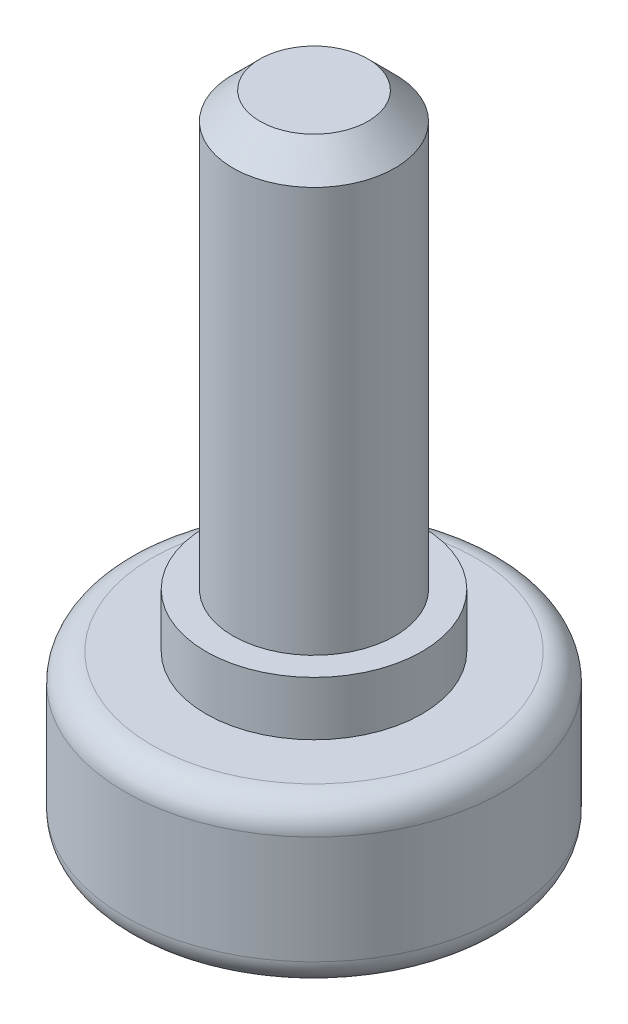
ISO-10303-21;
HEADER;
FILE_DESCRIPTION(('STEP AP214'),'2;1');
FILE_NAME('part.step','',(''),(''),'','','');
FILE_SCHEMA(('AUTOMOTIVE_DESIGN { 1 0 10303 214 1 1 1 1 }'));
ENDSEC;
DATA;
#1=APPLICATION_CONTEXT('core data for automotive mechanical design processes');
#2=APPLICATION_PROTOCOL_DEFINITION('international standard','automotive_design',2000,#1);
#3=PRODUCT_CONTEXT('',#1,'mechanical');
#4=PRODUCT('Part','Part','',(#3));
#5=PRODUCT_RELATED_PRODUCT_CATEGORY('part','',(#4));
#6=PRODUCT_DEFINITION_FORMATION('','',#4);
#7=PRODUCT_DEFINITION_CONTEXT('part definition',#1,'design');
#8=PRODUCT_DEFINITION('design','',#6,#7);
#9=PRODUCT_DEFINITION_SHAPE('','',#8);
#10=(LENGTH_UNIT() NAMED_UNIT(*) SI_UNIT(.MILLI.,.METRE.));
#11=(NAMED_UNIT(*) PLANE_ANGLE_UNIT() SI_UNIT($,.RADIAN.));
#12=(NAMED_UNIT(*) SI_UNIT($,.STERADIAN.) SOLID_ANGLE_UNIT());
#13=UNCERTAINTY_MEASURE_WITH_UNIT(LENGTH_MEASURE(1.E-05),#10,'distance_accuracy_value','');
#14=(GEOMETRIC_REPRESENTATION_CONTEXT(3) GLOBAL_UNCERTAINTY_ASSIGNED_CONTEXT((#13)) GLOBAL_UNIT_ASSIGNED_CONTEXT((#10,
#11,#12)) REPRESENTATION_CONTEXT('',''));
#15=CARTESIAN_POINT('',(0.,0.,0.));
#16=DIRECTION('',(0.,0.,1.));
#17=DIRECTION('',(1.,0.,0.));
#18=AXIS2_PLACEMENT_3D('',#15,#16,#17);
#19=CARTESIAN_POINT('',(0.,3.,0.));
#20=DIRECTION('',(0.,-1.,0.));
#21=DIRECTION('',(0.,0.,-1.));
#22=AXIS2_PLACEMENT_3D('',#19,#20,#21);
#23=CYLINDRICAL_SURFACE('',#22,3.5);
#24=CARTESIAN_POINT('',(0.,0.5,0.));
#25=DIRECTION('',(0.,1.,0.));
#26=DIRECTION('',(0.,0.,1.));
#27=AXIS2_PLACEMENT_3D('',#24,#25,#26);
#28=CIRCLE('',#27,3.5);
#29=CARTESIAN_POINT('',(0.,0.5,3.5));
#30=VERTEX_POINT('',#29);
#31=EDGE_CURVE('E60',#30,#30,#28,.T.);
#32=ORIENTED_EDGE('',*,*,#31,.T.);
#33=EDGE_LOOP('',(#32));
#34=FACE_BOUND('',#33,.T.);
#35=CARTESIAN_POINT('',(0.,2.5,0.));
#36=DIRECTION('',(0.,1.,0.));
#37=DIRECTION('',(0.,0.,1.));
#38=AXIS2_PLACEMENT_3D('',#35,#36,#37);
#39=CIRCLE('',#38,3.5);
#40=CARTESIAN_POINT('',(0.,2.5,3.5));
#41=VERTEX_POINT('',#40);
#42=EDGE_CURVE('E63',#41,#41,#39,.F.);
#43=ORIENTED_EDGE('',*,*,#42,.T.);
#44=EDGE_LOOP('',(#43));
#45=FACE_BOUND('',#44,.T.);
#46=ADVANCED_FACE('F39',(#34,#45),#23,.T.);
#47=CARTESIAN_POINT('',(0.,3.,0.));
#48=DIRECTION('',(0.,1.,0.));
#49=DIRECTION('',(0.,0.,1.));
#50=AXIS2_PLACEMENT_3D('',#47,#48,#49);
#51=PLANE('',#50);
#52=CARTESIAN_POINT('',(0.,3.,0.));
#53=DIRECTION('',(0.,1.,0.));
#54=DIRECTION('',(0.,0.,1.));
#55=AXIS2_PLACEMENT_3D('',#52,#53,#54);
#56=CIRCLE('',#55,3.);
#57=CARTESIAN_POINT('',(0.,3.,3.));
#58=VERTEX_POINT('',#57);
#59=EDGE_CURVE('E51',#58,#58,#56,.T.);
#60=ORIENTED_EDGE('',*,*,#59,.T.);
#61=EDGE_LOOP('',(#60));
#62=FACE_BOUND('',#61,.T.);
#63=CARTESIAN_POINT('',(0.,3.,0.));
#64=DIRECTION('',(0.,1.,0.));
#65=DIRECTION('',(0.,0.,1.));
#66=AXIS2_PLACEMENT_3D('',#63,#64,#65);
#67=CIRCLE('',#66,2.);
#68=CARTESIAN_POINT('',(0.,3.,2.));
#69=VERTEX_POINT('',#68);
#70=EDGE_CURVE('E67',#69,#69,#67,.T.);
#71=ORIENTED_EDGE('',*,*,#70,.F.);
#72=EDGE_LOOP('',(#71));
#73=FACE_BOUND('',#72,.T.);
#74=ADVANCED_FACE('F94',(#62,#73),#51,.T.);
#75=CARTESIAN_POINT('',(0.,0.,0.));
#76=DIRECTION('',(0.,1.,0.));
#77=DIRECTION('',(0.,0.,1.));
#78=AXIS2_PLACEMENT_3D('',#75,#76,#77);
#79=PLANE('',#78);
#80=CARTESIAN_POINT('',(0.,0.,0.));
#81=DIRECTION('',(0.,1.,0.));
#82=DIRECTION('',(0.,0.,1.));
#83=AXIS2_PLACEMENT_3D('',#80,#81,#82);
#84=CIRCLE('',#83,3.);
#85=CARTESIAN_POINT('',(0.,0.,3.));
#86=VERTEX_POINT('',#85);
#87=EDGE_CURVE('E55',#86,#86,#84,.F.);
#88=ORIENTED_EDGE('',*,*,#87,.T.);
#89=EDGE_LOOP('',(#88));
#90=FACE_BOUND('',#89,.T.);
#91=CARTESIAN_POINT('',(0.,0.,0.));
#92=DIRECTION('',(0.,-1.,0.));
#93=DIRECTION('',(0.,0.,-1.));
#94=AXIS2_PLACEMENT_3D('',#91,#92,#93);
#95=CIRCLE('',#94,1.);
#96=CARTESIAN_POINT('',(0.,0.,-1.));
#97=VERTEX_POINT('',#96);
#98=EDGE_CURVE('E76',#97,#97,#95,.T.);
#99=ORIENTED_EDGE('',*,*,#98,.F.);
#100=EDGE_LOOP('',(#99));
#101=FACE_BOUND('',#100,.T.);
#102=ADVANCED_FACE('F91',(#90,#101),#79,.F.);
#103=CARTESIAN_POINT('',(0.,4.,0.));
#104=DIRECTION('',(0.,-1.,0.));
#105=DIRECTION('',(0.,0.,-1.));
#106=AXIS2_PLACEMENT_3D('',#103,#104,#105);
#107=CYLINDRICAL_SURFACE('',#106,2.);
#108=CARTESIAN_POINT('',(0.,4.,0.));
#109=DIRECTION('',(0.,1.,0.));
#110=DIRECTION('',(0.,0.,1.));
#111=AXIS2_PLACEMENT_3D('',#108,#109,#110);
#112=CIRCLE('',#111,2.);
#113=CARTESIAN_POINT('',(0.,4.,2.));
#114=VERTEX_POINT('',#113);
#115=EDGE_CURVE('E70',#114,#114,#112,.T.);
#116=ORIENTED_EDGE('',*,*,#115,.F.);
#117=EDGE_LOOP('',(#116));
#118=FACE_BOUND('',#117,.T.);
#119=ORIENTED_EDGE('',*,*,#70,.T.);
#120=EDGE_LOOP('',(#119));
#121=FACE_BOUND('',#120,.T.);
#122=ADVANCED_FACE('F93',(#118,#121),#107,.T.);
#123=CARTESIAN_POINT('',(0.,4.,0.));
#124=DIRECTION('',(0.,1.,0.));
#125=DIRECTION('',(0.,0.,1.));
#126=AXIS2_PLACEMENT_3D('',#123,#124,#125);
#127=PLANE('',#126);
#128=CARTESIAN_POINT('',(0.,4.,0.));
#129=DIRECTION('',(0.,1.,0.));
#130=DIRECTION('',(0.,0.,1.));
#131=AXIS2_PLACEMENT_3D('',#128,#129,#130);
#132=CIRCLE('',#131,1.5);
#133=CARTESIAN_POINT('',(0.,4.,1.5));
#134=VERTEX_POINT('',#133);
#135=EDGE_CURVE('E66',#134,#134,#132,.T.);
#136=ORIENTED_EDGE('',*,*,#135,.F.);
#137=EDGE_LOOP('',(#136));
#138=FACE_BOUND('',#137,.T.);
#139=ORIENTED_EDGE('',*,*,#115,.T.);
#140=EDGE_LOOP('',(#139));
#141=FACE_BOUND('',#140,.T.);
#142=ADVANCED_FACE('F102',(#138,#141),#127,.T.);
#143=CARTESIAN_POINT('',(0.,12.,0.));
#144=DIRECTION('',(0.,-1.,0.));
#145=DIRECTION('',(0.,0.,-1.));
#146=AXIS2_PLACEMENT_3D('',#143,#144,#145);
#147=CYLINDRICAL_SURFACE('',#146,1.5);
#148=CARTESIAN_POINT('',(0.,11.5,0.));
#149=DIRECTION('',(0.,1.,0.));
#150=DIRECTION('',(0.,0.,1.));
#151=AXIS2_PLACEMENT_3D('',#148,#149,#150);
#152=CIRCLE('',#151,1.5);
#153=CARTESIAN_POINT('',(0.,11.5,1.5));
#154=VERTEX_POINT('',#153);
#155=EDGE_CURVE('E10',#154,#154,#152,.F.);
#156=ORIENTED_EDGE('',*,*,#155,.T.);
#157=EDGE_LOOP('',(#156));
#158=FACE_BOUND('',#157,.T.);
#159=ORIENTED_EDGE('',*,*,#135,.T.);
#160=EDGE_LOOP('',(#159));
#161=FACE_BOUND('',#160,.T.);
#162=ADVANCED_FACE('F140',(#158,#161),#147,.T.);
#163=CARTESIAN_POINT('',(0.,12.,0.));
#164=DIRECTION('',(0.,1.,0.));
#165=DIRECTION('',(0.,0.,1.));
#166=AXIS2_PLACEMENT_3D('',#163,#164,#165);
#167=PLANE('',#166);
#168=CARTESIAN_POINT('',(0.,12.,0.));
#169=DIRECTION('',(0.,1.,0.));
#170=DIRECTION('',(0.,0.,1.));
#171=AXIS2_PLACEMENT_3D('',#168,#169,#170);
#172=CIRCLE('',#171,0.999999999999996);
#173=CARTESIAN_POINT('',(0.,12.,0.999999999999996));
#174=VERTEX_POINT('',#173);
#175=EDGE_CURVE('E47',#174,#174,#172,.T.);
#176=ORIENTED_EDGE('',*,*,#175,.T.);
#177=EDGE_LOOP('',(#176));
#178=FACE_BOUND('',#177,.T.);
#179=ADVANCED_FACE('F87',(#178),#167,.T.);
#180=CARTESIAN_POINT('',(0.,1.5,0.));
#181=DIRECTION('',(0.,-1.,0.));
#182=DIRECTION('',(0.,0.,-1.));
#183=AXIS2_PLACEMENT_3D('',#180,#181,#182);
#184=CYLINDRICAL_SURFACE('',#183,1.);
#185=CARTESIAN_POINT('',(0.,1.5,0.));
#186=DIRECTION('',(0.,-1.,0.));
#187=DIRECTION('',(0.,0.,-1.));
#188=AXIS2_PLACEMENT_3D('',#185,#186,#187);
#189=CIRCLE('',#188,1.);
#190=CARTESIAN_POINT('',(0.,1.5,-1.));
#191=VERTEX_POINT('',#190);
#192=EDGE_CURVE('E73',#191,#191,#189,.T.);
#193=ORIENTED_EDGE('',*,*,#192,.F.);
#194=EDGE_LOOP('',(#193));
#195=FACE_BOUND('',#194,.T.);
#196=ORIENTED_EDGE('',*,*,#98,.T.);
#197=EDGE_LOOP('',(#196));
#198=FACE_BOUND('',#197,.T.);
#199=ADVANCED_FACE('F84',(#195,#198),#184,.F.);
#200=CARTESIAN_POINT('',(0.,1.5,0.));
#201=DIRECTION('',(0.,-1.,0.));
#202=DIRECTION('',(0.,0.,-1.));
#203=AXIS2_PLACEMENT_3D('',#200,#201,#202);
#204=PLANE('',#203);
#205=ORIENTED_EDGE('',*,*,#192,.T.);
#206=EDGE_LOOP('',(#205));
#207=FACE_BOUND('',#206,.T.);
#208=ADVANCED_FACE('F82',(#207),#204,.T.);
#209=CARTESIAN_POINT('',(0.,0.5,0.));
#210=DIRECTION('',(0.,1.,0.));
#211=DIRECTION('',(0.,0.,1.));
#212=AXIS2_PLACEMENT_3D('',#209,#210,#211);
#213=TOROIDAL_SURFACE('',#212,3.,0.5);
#214=ORIENTED_EDGE('',*,*,#87,.F.);
#215=EDGE_LOOP('',(#214));
#216=FACE_BOUND('',#215,.T.);
#217=ORIENTED_EDGE('',*,*,#31,.F.);
#218=EDGE_LOOP('',(#217));
#219=FACE_BOUND('',#218,.T.);
#220=ADVANCED_FACE('F115',(#216,#219),#213,.T.);
#221=CARTESIAN_POINT('',(0.,2.5,0.));
#222=DIRECTION('',(0.,1.,0.));
#223=DIRECTION('',(0.,0.,1.));
#224=AXIS2_PLACEMENT_3D('',#221,#222,#223);
#225=TOROIDAL_SURFACE('',#224,3.,0.5);
#226=ORIENTED_EDGE('',*,*,#42,.F.);
#227=EDGE_LOOP('',(#226));
#228=FACE_BOUND('',#227,.T.);
#229=ORIENTED_EDGE('',*,*,#59,.F.);
#230=EDGE_LOOP('',(#229));
#231=FACE_BOUND('',#230,.T.);
#232=ADVANCED_FACE('F116',(#228,#231),#225,.T.);
#233=CARTESIAN_POINT('',(0.,12.,0.));
#234=DIRECTION('',(0.,-1.,0.));
#235=DIRECTION('',(0.,0.,-1.));
#236=AXIS2_PLACEMENT_3D('',#233,#234,#235);
#237=CONICAL_SURFACE('',#236,0.999999999999996,0.785398163397447);
#238=ORIENTED_EDGE('',*,*,#155,.F.);
#239=EDGE_LOOP('',(#238));
#240=FACE_BOUND('',#239,.T.);
#241=ORIENTED_EDGE('',*,*,#175,.F.);
#242=EDGE_LOOP('',(#241));
#243=FACE_BOUND('',#242,.T.);
#244=ADVANCED_FACE('F42',(#240,#243),#237,.T.);
#245=CLOSED_SHELL('',(#46,#74,#102,#122,#142,#162,#179,#199,#208,#220,#232,#244));
#246=MANIFOLD_SOLID_BREP('B2',#245);
#247=ADVANCED_BREP_SHAPE_REPRESENTATION('',(#18,#246),#14);
#248=SHAPE_DEFINITION_REPRESENTATION(#9,#247);
ENDSEC;
END-ISO-10303-21;
